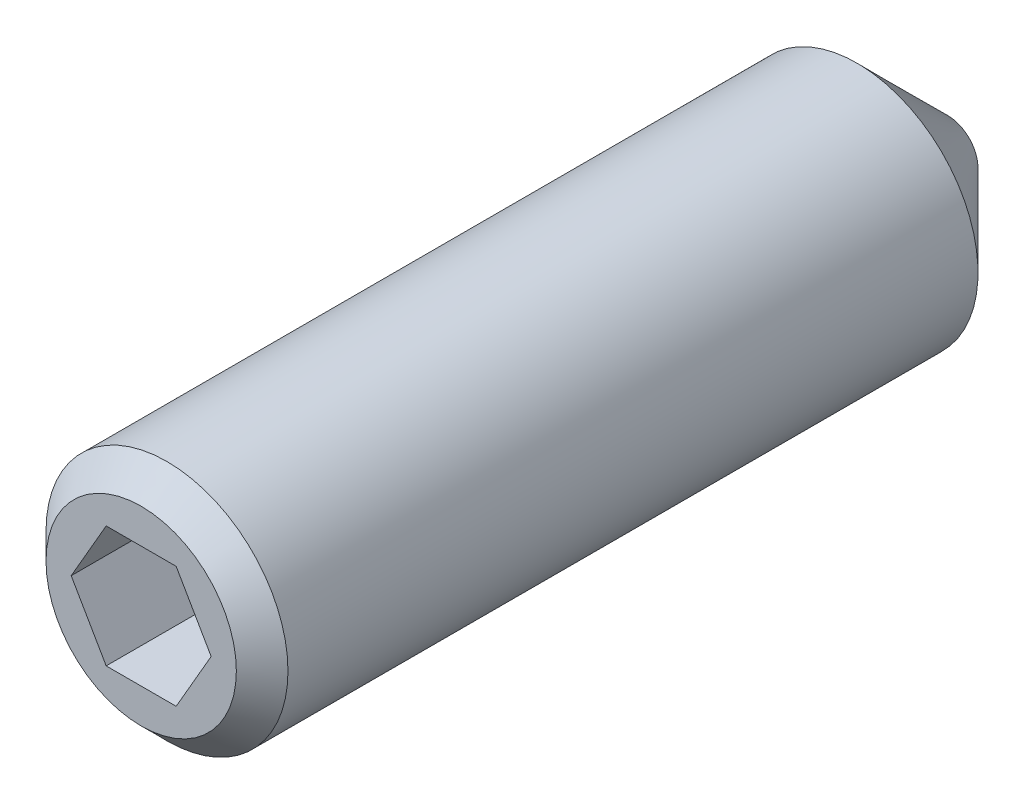
ISO-10303-21;
HEADER;
FILE_DESCRIPTION(('STEP AP214'),'2;1');
FILE_NAME('part.step','',(''),(''),'','','');
FILE_SCHEMA(('AUTOMOTIVE_DESIGN { 1 0 10303 214 1 1 1 1 }'));
ENDSEC;
DATA;
#1=APPLICATION_CONTEXT('core data for automotive mechanical design processes');
#2=APPLICATION_PROTOCOL_DEFINITION('international standard','automotive_design',2000,#1);
#3=PRODUCT_CONTEXT('',#1,'mechanical');
#4=PRODUCT('Part','Part','',(#3));
#5=PRODUCT_RELATED_PRODUCT_CATEGORY('part','',(#4));
#6=PRODUCT_DEFINITION_FORMATION('','',#4);
#7=PRODUCT_DEFINITION_CONTEXT('part definition',#1,'design');
#8=PRODUCT_DEFINITION('design','',#6,#7);
#9=PRODUCT_DEFINITION_SHAPE('','',#8);
#10=(LENGTH_UNIT() NAMED_UNIT(*) SI_UNIT(.MILLI.,.METRE.));
#11=(NAMED_UNIT(*) PLANE_ANGLE_UNIT() SI_UNIT($,.RADIAN.));
#12=(NAMED_UNIT(*) SI_UNIT($,.STERADIAN.) SOLID_ANGLE_UNIT());
#13=UNCERTAINTY_MEASURE_WITH_UNIT(LENGTH_MEASURE(1.E-05),#10,'distance_accuracy_value','');
#14=(GEOMETRIC_REPRESENTATION_CONTEXT(3) GLOBAL_UNCERTAINTY_ASSIGNED_CONTEXT((#13)) GLOBAL_UNIT_ASSIGNED_CONTEXT((#10,
#11,#12)) REPRESENTATION_CONTEXT('',''));
#15=CARTESIAN_POINT('',(0.,0.,0.));
#16=DIRECTION('',(0.,0.,1.));
#17=DIRECTION('',(1.,0.,0.));
#18=AXIS2_PLACEMENT_3D('',#15,#16,#17);
#19=CARTESIAN_POINT('',(0.,0.,10.));
#20=DIRECTION('',(0.,0.,-1.));
#21=DIRECTION('',(-1.,0.,0.));
#22=AXIS2_PLACEMENT_3D('',#19,#20,#21);
#23=CYLINDRICAL_SURFACE('',#22,1.5);
#24=CARTESIAN_POINT('',(0.,0.,9.68));
#25=DIRECTION('',(0.,0.,-1.));
#26=DIRECTION('',(-1.,0.,0.));
#27=AXIS2_PLACEMENT_3D('',#24,#25,#26);
#28=CIRCLE('',#27,1.5);
#29=CARTESIAN_POINT('',(-1.5,0.,9.68));
#30=VERTEX_POINT('',#29);
#31=EDGE_CURVE('E124',#30,#30,#28,.F.);
#32=ORIENTED_EDGE('',*,*,#31,.F.);
#33=EDGE_LOOP('',(#32));
#34=FACE_BOUND('',#33,.T.);
#35=CARTESIAN_POINT('',(0.,0.,1.125));
#36=DIRECTION('',(0.,0.,1.));
#37=DIRECTION('',(1.,0.,0.));
#38=AXIS2_PLACEMENT_3D('',#35,#36,#37);
#39=CIRCLE('',#38,1.5);
#40=CARTESIAN_POINT('',(-1.5,0.,1.125));
#41=VERTEX_POINT('',#40);
#42=EDGE_CURVE('E39',#41,#41,#39,.F.);
#43=ORIENTED_EDGE('',*,*,#42,.F.);
#44=EDGE_LOOP('',(#43));
#45=FACE_BOUND('',#44,.T.);
#46=ADVANCED_FACE('F36',(#34,#45),#23,.T.);
#47=CARTESIAN_POINT('',(0.,0.,10.));
#48=DIRECTION('',(0.,0.,1.));
#49=DIRECTION('',(1.,0.,0.));
#50=AXIS2_PLACEMENT_3D('',#47,#48,#49);
#51=PLANE('',#50);
#52=DIRECTION('',(0.499999999999995,0.866025403784441,0.));
#53=VECTOR('',#52,1.);
#54=CARTESIAN_POINT('',(0.43382575183851,-0.751408243816046,10.));
#55=LINE('',#54,#53);
#56=CARTESIAN_POINT('',(0.43382575183851,-0.751408243816046,10.));
#57=VERTEX_POINT('',#56);
#58=CARTESIAN_POINT('',(0.867651503677002,0.,10.));
#59=VERTEX_POINT('',#58);
#60=EDGE_CURVE('E51',#57,#59,#55,.T.);
#61=ORIENTED_EDGE('',*,*,#60,.F.);
#62=DIRECTION('',(1.,0.,0.));
#63=VECTOR('',#62,1.);
#64=CARTESIAN_POINT('',(-0.433825751838494,-0.751408243816055,10.));
#65=LINE('',#64,#63);
#66=CARTESIAN_POINT('',(-0.433825751838494,-0.751408243816055,10.));
#67=VERTEX_POINT('',#66);
#68=EDGE_CURVE('E133',#67,#57,#65,.T.);
#69=ORIENTED_EDGE('',*,*,#68,.F.);
#70=DIRECTION('',(0.500000000000007,-0.866025403784435,0.));
#71=VECTOR('',#70,1.);
#72=CARTESIAN_POINT('',(-0.867651503677002,0.,10.));
#73=LINE('',#72,#71);
#74=CARTESIAN_POINT('',(-0.867651503677002,0.,10.));
#75=VERTEX_POINT('',#74);
#76=EDGE_CURVE('E131',#75,#67,#73,.T.);
#77=ORIENTED_EDGE('',*,*,#76,.F.);
#78=DIRECTION('',(-0.499999999999995,-0.866025403784442,0.));
#79=VECTOR('',#78,1.);
#80=CARTESIAN_POINT('',(-0.433825751838504,0.751408243816049,10.));
#81=LINE('',#80,#79);
#82=CARTESIAN_POINT('',(-0.433825751838504,0.751408243816049,10.));
#83=VERTEX_POINT('',#82);
#84=EDGE_CURVE('E98',#83,#75,#81,.T.);
#85=ORIENTED_EDGE('',*,*,#84,.F.);
#86=DIRECTION('',(-1.,0.,0.));
#87=VECTOR('',#86,1.);
#88=CARTESIAN_POINT('',(0.433825751838499,0.751408243816052,10.));
#89=LINE('',#88,#87);
#90=CARTESIAN_POINT('',(0.433825751838499,0.751408243816052,10.));
#91=VERTEX_POINT('',#90);
#92=EDGE_CURVE('E127',#91,#83,#89,.T.);
#93=ORIENTED_EDGE('',*,*,#92,.F.);
#94=DIRECTION('',(-0.500000000000001,0.866025403784438,0.));
#95=VECTOR('',#94,1.);
#96=CARTESIAN_POINT('',(0.867651503677002,0.,10.));
#97=LINE('',#96,#95);
#98=EDGE_CURVE('E123',#59,#91,#97,.T.);
#99=ORIENTED_EDGE('',*,*,#98,.F.);
#100=EDGE_LOOP('',(#61,#69,#77,#85,#93,#99));
#101=FACE_BOUND('',#100,.T.);
#102=CARTESIAN_POINT('',(0.,0.,10.));
#103=DIRECTION('',(0.,0.,1.));
#104=DIRECTION('',(1.,0.,0.));
#105=AXIS2_PLACEMENT_3D('',#102,#103,#104);
#106=CIRCLE('',#105,1.18);
#107=CARTESIAN_POINT('',(1.18,0.,10.));
#108=VERTEX_POINT('',#107);
#109=EDGE_CURVE('E153',#108,#108,#106,.T.);
#110=ORIENTED_EDGE('',*,*,#109,.T.);
#111=EDGE_LOOP('',(#110));
#112=FACE_BOUND('',#111,.T.);
#113=ADVANCED_FACE('F144',(#101,#112),#51,.T.);
#114=CARTESIAN_POINT('',(0.43382575183851,-0.751408243816046,8.8));
#115=DIRECTION('',(0.866025403784441,-0.499999999999995,0.));
#116=DIRECTION('',(0.499999999999995,0.866025403784442,0.));
#117=AXIS2_PLACEMENT_3D('',#114,#115,#116);
#118=PLANE('',#117);
#119=ORIENTED_EDGE('',*,*,#60,.T.);
#120=DIRECTION('',(0.,0.,1.));
#121=VECTOR('',#120,1.);
#122=CARTESIAN_POINT('',(0.867651503677002,0.,8.8));
#123=LINE('',#122,#121);
#124=CARTESIAN_POINT('',(0.867651503677002,0.,8.8));
#125=VERTEX_POINT('',#124);
#126=EDGE_CURVE('E80',#125,#59,#123,.T.);
#127=ORIENTED_EDGE('',*,*,#126,.F.);
#128=DIRECTION('',(0.499999999999995,0.866025403784441,0.));
#129=VECTOR('',#128,1.);
#130=CARTESIAN_POINT('',(0.43382575183851,-0.751408243816046,8.8));
#131=LINE('',#130,#129);
#132=CARTESIAN_POINT('',(0.43382575183851,-0.751408243816046,8.8));
#133=VERTEX_POINT('',#132);
#134=EDGE_CURVE('E134',#133,#125,#131,.T.);
#135=ORIENTED_EDGE('',*,*,#134,.F.);
#136=DIRECTION('',(0.,0.,1.));
#137=VECTOR('',#136,1.);
#138=CARTESIAN_POINT('',(0.43382575183851,-0.751408243816046,8.8));
#139=LINE('',#138,#137);
#140=EDGE_CURVE('E12',#133,#57,#139,.T.);
#141=ORIENTED_EDGE('',*,*,#140,.T.);
#142=EDGE_LOOP('',(#119,#127,#135,#141));
#143=FACE_BOUND('',#142,.T.);
#144=ADVANCED_FACE('F170',(#143),#118,.F.);
#145=CARTESIAN_POINT('',(-0.433825751838494,-0.751408243816055,8.8));
#146=DIRECTION('',(0.,-1.,0.));
#147=DIRECTION('',(1.,0.,0.));
#148=AXIS2_PLACEMENT_3D('',#145,#146,#147);
#149=PLANE('',#148);
#150=ORIENTED_EDGE('',*,*,#68,.T.);
#151=ORIENTED_EDGE('',*,*,#140,.F.);
#152=DIRECTION('',(1.,0.,0.));
#153=VECTOR('',#152,1.);
#154=CARTESIAN_POINT('',(-0.433825751838494,-0.751408243816055,8.8));
#155=LINE('',#154,#153);
#156=CARTESIAN_POINT('',(-0.433825751838494,-0.751408243816055,8.8));
#157=VERTEX_POINT('',#156);
#158=EDGE_CURVE('E109',#157,#133,#155,.T.);
#159=ORIENTED_EDGE('',*,*,#158,.F.);
#160=DIRECTION('',(0.,0.,1.));
#161=VECTOR('',#160,1.);
#162=CARTESIAN_POINT('',(-0.433825751838494,-0.751408243816055,8.8));
#163=LINE('',#162,#161);
#164=EDGE_CURVE('E44',#157,#67,#163,.T.);
#165=ORIENTED_EDGE('',*,*,#164,.T.);
#166=EDGE_LOOP('',(#150,#151,#159,#165));
#167=FACE_BOUND('',#166,.T.);
#168=ADVANCED_FACE('F188',(#167),#149,.F.);
#169=CARTESIAN_POINT('',(-0.867651503677002,0.,8.8));
#170=DIRECTION('',(-0.866025403784434,-0.500000000000007,0.));
#171=DIRECTION('',(0.500000000000007,-0.866025403784435,0.));
#172=AXIS2_PLACEMENT_3D('',#169,#170,#171);
#173=PLANE('',#172);
#174=ORIENTED_EDGE('',*,*,#76,.T.);
#175=ORIENTED_EDGE('',*,*,#164,.F.);
#176=DIRECTION('',(0.500000000000007,-0.866025403784435,0.));
#177=VECTOR('',#176,1.);
#178=CARTESIAN_POINT('',(-0.867651503677002,0.,8.8));
#179=LINE('',#178,#177);
#180=CARTESIAN_POINT('',(-0.867651503677002,0.,8.8));
#181=VERTEX_POINT('',#180);
#182=EDGE_CURVE('E105',#181,#157,#179,.T.);
#183=ORIENTED_EDGE('',*,*,#182,.F.);
#184=DIRECTION('',(0.,0.,1.));
#185=VECTOR('',#184,1.);
#186=CARTESIAN_POINT('',(-0.867651503677002,0.,8.8));
#187=LINE('',#186,#185);
#188=EDGE_CURVE('E91',#181,#75,#187,.T.);
#189=ORIENTED_EDGE('',*,*,#188,.T.);
#190=EDGE_LOOP('',(#174,#175,#183,#189));
#191=FACE_BOUND('',#190,.T.);
#192=ADVANCED_FACE('F106',(#191),#173,.F.);
#193=CARTESIAN_POINT('',(-0.433825751838504,0.751408243816049,8.8));
#194=DIRECTION('',(-0.866025403784441,0.499999999999995,0.));
#195=DIRECTION('',(-0.499999999999995,-0.866025403784442,0.));
#196=AXIS2_PLACEMENT_3D('',#193,#194,#195);
#197=PLANE('',#196);
#198=ORIENTED_EDGE('',*,*,#84,.T.);
#199=ORIENTED_EDGE('',*,*,#188,.F.);
#200=DIRECTION('',(-0.499999999999995,-0.866025403784442,0.));
#201=VECTOR('',#200,1.);
#202=CARTESIAN_POINT('',(-0.433825751838504,0.751408243816049,8.8));
#203=LINE('',#202,#201);
#204=CARTESIAN_POINT('',(-0.433825751838504,0.751408243816049,8.8));
#205=VERTEX_POINT('',#204);
#206=EDGE_CURVE('E95',#205,#181,#203,.T.);
#207=ORIENTED_EDGE('',*,*,#206,.F.);
#208=DIRECTION('',(0.,0.,1.));
#209=VECTOR('',#208,1.);
#210=CARTESIAN_POINT('',(-0.433825751838504,0.751408243816049,8.8));
#211=LINE('',#210,#209);
#212=EDGE_CURVE('E102',#205,#83,#211,.T.);
#213=ORIENTED_EDGE('',*,*,#212,.T.);
#214=EDGE_LOOP('',(#198,#199,#207,#213));
#215=FACE_BOUND('',#214,.T.);
#216=ADVANCED_FACE('F93',(#215),#197,.F.);
#217=CARTESIAN_POINT('',(0.433825751838499,0.751408243816052,8.8));
#218=DIRECTION('',(0.,1.,0.));
#219=DIRECTION('',(-1.,0.,0.));
#220=AXIS2_PLACEMENT_3D('',#217,#218,#219);
#221=PLANE('',#220);
#222=ORIENTED_EDGE('',*,*,#92,.T.);
#223=ORIENTED_EDGE('',*,*,#212,.F.);
#224=DIRECTION('',(-1.,0.,0.));
#225=VECTOR('',#224,1.);
#226=CARTESIAN_POINT('',(0.433825751838499,0.751408243816052,8.8));
#227=LINE('',#226,#225);
#228=CARTESIAN_POINT('',(0.433825751838499,0.751408243816052,8.8));
#229=VERTEX_POINT('',#228);
#230=EDGE_CURVE('E115',#229,#205,#227,.T.);
#231=ORIENTED_EDGE('',*,*,#230,.F.);
#232=DIRECTION('',(0.,0.,1.));
#233=VECTOR('',#232,1.);
#234=CARTESIAN_POINT('',(0.433825751838499,0.751408243816052,8.8));
#235=LINE('',#234,#233);
#236=EDGE_CURVE('E138',#229,#91,#235,.T.);
#237=ORIENTED_EDGE('',*,*,#236,.T.);
#238=EDGE_LOOP('',(#222,#223,#231,#237));
#239=FACE_BOUND('',#238,.T.);
#240=ADVANCED_FACE('F148',(#239),#221,.F.);
#241=CARTESIAN_POINT('',(0.867651503677002,0.,8.8));
#242=DIRECTION('',(0.866025403784438,0.500000000000001,0.));
#243=DIRECTION('',(-0.500000000000001,0.866025403784438,0.));
#244=AXIS2_PLACEMENT_3D('',#241,#242,#243);
#245=PLANE('',#244);
#246=ORIENTED_EDGE('',*,*,#98,.T.);
#247=ORIENTED_EDGE('',*,*,#236,.F.);
#248=DIRECTION('',(-0.500000000000001,0.866025403784438,0.));
#249=VECTOR('',#248,1.);
#250=CARTESIAN_POINT('',(0.867651503677002,0.,8.8));
#251=LINE('',#250,#249);
#252=EDGE_CURVE('E117',#125,#229,#251,.T.);
#253=ORIENTED_EDGE('',*,*,#252,.F.);
#254=ORIENTED_EDGE('',*,*,#126,.T.);
#255=EDGE_LOOP('',(#246,#247,#253,#254));
#256=FACE_BOUND('',#255,.T.);
#257=ADVANCED_FACE('F141',(#256),#245,.F.);
#258=CARTESIAN_POINT('',(0.,0.,8.8));
#259=DIRECTION('',(0.,0.,1.));
#260=DIRECTION('',(1.,0.,0.));
#261=AXIS2_PLACEMENT_3D('',#258,#259,#260);
#262=PLANE('',#261);
#263=ORIENTED_EDGE('',*,*,#134,.T.);
#264=ORIENTED_EDGE('',*,*,#252,.T.);
#265=ORIENTED_EDGE('',*,*,#230,.T.);
#266=ORIENTED_EDGE('',*,*,#206,.T.);
#267=ORIENTED_EDGE('',*,*,#182,.T.);
#268=ORIENTED_EDGE('',*,*,#158,.T.);
#269=EDGE_LOOP('',(#263,#264,#265,#266,#267,#268));
#270=FACE_BOUND('',#269,.T.);
#271=ADVANCED_FACE('F112',(#270),#262,.T.);
#272=CARTESIAN_POINT('',(0.,0.,10.));
#273=DIRECTION('',(0.,0.,-1.));
#274=DIRECTION('',(1.,0.,0.));
#275=AXIS2_PLACEMENT_3D('',#272,#273,#274);
#276=CONICAL_SURFACE('',#275,1.18,0.78539816339745);
#277=ORIENTED_EDGE('',*,*,#109,.F.);
#278=EDGE_LOOP('',(#277));
#279=FACE_BOUND('',#278,.T.);
#280=ORIENTED_EDGE('',*,*,#31,.T.);
#281=EDGE_LOOP('',(#280));
#282=FACE_BOUND('',#281,.T.);
#283=ADVANCED_FACE('F174',(#279,#282),#276,.T.);
#284=CARTESIAN_POINT('',(0.,0.,0.));
#285=DIRECTION('',(0.,0.,1.));
#286=DIRECTION('',(-1.,0.,0.));
#287=AXIS2_PLACEMENT_3D('',#284,#285,#286);
#288=CONICAL_SURFACE('',#287,0.375,0.78539816339745);
#289=CARTESIAN_POINT('',(0.,0.,0.));
#290=DIRECTION('',(0.,0.,-1.));
#291=DIRECTION('',(-1.,0.,0.));
#292=AXIS2_PLACEMENT_3D('',#289,#290,#291);
#293=CIRCLE('',#292,0.375);
#294=CARTESIAN_POINT('',(-0.375,0.,0.));
#295=VERTEX_POINT('',#294);
#296=EDGE_CURVE('E156',#295,#295,#293,.T.);
#297=CARTESIAN_POINT('',(-0.375,0.,0.));
#298=CARTESIAN_POINT('',(-0.38671875,0.,0.0117187499999999));
#299=CARTESIAN_POINT('',(-0.3984375,0.,0.0234374999999999));
#300=CARTESIAN_POINT('',(-0.421875,0.,0.0468749999999998));
#301=CARTESIAN_POINT('',(-0.43359375,0.,0.0585937499999998));
#302=CARTESIAN_POINT('',(-0.45703125,0.,0.0820312499999997));
#303=CARTESIAN_POINT('',(-0.46875,0.,0.0937499999999996));
#304=CARTESIAN_POINT('',(-0.4921875,0.,0.1171875));
#305=CARTESIAN_POINT('',(-0.50390625,0.,0.12890625));
#306=CARTESIAN_POINT('',(-0.52734375,0.,0.152343749999999));
#307=CARTESIAN_POINT('',(-0.5390625,0.,0.164062499999999));
#308=CARTESIAN_POINT('',(-0.5625,0.,0.187499999999999));
#309=CARTESIAN_POINT('',(-0.57421875,0.,0.199218749999999));
#310=CARTESIAN_POINT('',(-0.59765625,0.,0.222656249999999));
#311=CARTESIAN_POINT('',(-0.609375,0.,0.234374999999999));
#312=CARTESIAN_POINT('',(-0.6328125,0.,0.257812499999999));
#313=CARTESIAN_POINT('',(-0.64453125,0.,0.269531249999999));
#314=CARTESIAN_POINT('',(-0.66796875,0.,0.292968749999999));
#315=CARTESIAN_POINT('',(-0.6796875,0.,0.304687499999999));
#316=CARTESIAN_POINT('',(-0.703125,0.,0.328124999999999));
#317=CARTESIAN_POINT('',(-0.71484375,0.,0.339843749999999));
#318=CARTESIAN_POINT('',(-0.73828125,0.,0.363281249999999));
#319=CARTESIAN_POINT('',(-0.75,0.,0.374999999999999));
#320=CARTESIAN_POINT('',(-0.7734375,0.,0.398437499999999));
#321=CARTESIAN_POINT('',(-0.78515625,0.,0.410156249999998));
#322=CARTESIAN_POINT('',(-0.80859375,0.,0.433593749999998));
#323=CARTESIAN_POINT('',(-0.8203125,0.,0.445312499999998));
#324=CARTESIAN_POINT('',(-0.84375,0.,0.468749999999998));
#325=CARTESIAN_POINT('',(-0.85546875,0.,0.480468749999998));
#326=CARTESIAN_POINT('',(-0.87890625,0.,0.503906249999998));
#327=CARTESIAN_POINT('',(-0.890625,0.,0.515624999999998));
#328=CARTESIAN_POINT('',(-0.9140625,0.,0.539062499999998));
#329=CARTESIAN_POINT('',(-0.92578125,0.,0.550781249999998));
#330=CARTESIAN_POINT('',(-0.94921875,0.,0.574218749999998));
#331=CARTESIAN_POINT('',(-0.9609375,0.,0.585937499999998));
#332=CARTESIAN_POINT('',(-0.984375,0.,0.609374999999998));
#333=CARTESIAN_POINT('',(-0.99609375,0.,0.621093749999998));
#334=CARTESIAN_POINT('',(-1.01953125,0.,0.644531249999998));
#335=CARTESIAN_POINT('',(-1.03125,0.,0.656249999999998));
#336=CARTESIAN_POINT('',(-1.0546875,0.,0.679687499999997));
#337=CARTESIAN_POINT('',(-1.06640625,0.,0.691406249999997));
#338=CARTESIAN_POINT('',(-1.08984375,0.,0.714843749999997));
#339=CARTESIAN_POINT('',(-1.1015625,0.,0.726562499999997));
#340=CARTESIAN_POINT('',(-1.125,0.,0.749999999999997));
#341=CARTESIAN_POINT('',(-1.13671875,0.,0.761718749999997));
#342=CARTESIAN_POINT('',(-1.16015625,0.,0.785156249999997));
#343=CARTESIAN_POINT('',(-1.171875,0.,0.796874999999997));
#344=CARTESIAN_POINT('',(-1.1953125,0.,0.820312499999997));
#345=CARTESIAN_POINT('',(-1.20703125,0.,0.832031249999997));
#346=CARTESIAN_POINT('',(-1.23046875,0.,0.855468749999997));
#347=CARTESIAN_POINT('',(-1.2421875,0.,0.867187499999997));
#348=CARTESIAN_POINT('',(-1.265625,0.,0.890624999999997));
#349=CARTESIAN_POINT('',(-1.27734375,0.,0.902343749999997));
#350=CARTESIAN_POINT('',(-1.30078125,0.,0.925781249999997));
#351=CARTESIAN_POINT('',(-1.3125,0.,0.937499999999996));
#352=CARTESIAN_POINT('',(-1.3359375,0.,0.960937499999996));
#353=CARTESIAN_POINT('',(-1.34765625,0.,0.972656249999996));
#354=CARTESIAN_POINT('',(-1.37109375,0.,0.996093749999996));
#355=CARTESIAN_POINT('',(-1.3828125,0.,1.0078125));
#356=CARTESIAN_POINT('',(-1.40625,0.,1.03125));
#357=CARTESIAN_POINT('',(-1.41796875,0.,1.04296875));
#358=CARTESIAN_POINT('',(-1.44140625,0.,1.06640625));
#359=CARTESIAN_POINT('',(-1.453125,0.,1.078125));
#360=CARTESIAN_POINT('',(-1.4765625,0.,1.1015625));
#361=CARTESIAN_POINT('',(-1.48828125,0.,1.11328125));
#362=CARTESIAN_POINT('',(-1.5,0.,1.125));
#363=B_SPLINE_CURVE_WITH_KNOTS('',3,(#297,#298,#299,#300,#301,#302,#303,#304,#305,#306,#307,
#308,#309,#310,#311,#312,#313,#314,#315,#316,#317,#318,#319,#320,#321,#322,#323,#324,#325,#326,
#327,#328,#329,#330,#331,#332,#333,#334,#335,#336,#337,#338,#339,#340,#341,#342,#343,#344,#345,
#346,#347,#348,#349,#350,#351,#352,#353,#354,#355,#356,#357,#358,#359,#360,#361,#362),
.UNSPECIFIED.,.F.,.F.,(4,2,2,2,2,2,2,2,2,2,2,2,2,2,2,2,2,2,2,2,2,2,2,2,2,2,2,2,2,2,2,2,4),(0.,
0.049718445552179,0.099436891104358,0.149155336656537,0.198873782208716,0.248592227760895,
0.298310673313074,0.348029118865253,0.397747564417432,0.447466009969611,0.49718445552179,
0.546902901073969,0.596621346626148,0.646339792178327,0.696058237730506,0.745776683282685,
0.795495128834864,0.845213574387043,0.894932019939222,0.944650465491402,0.99436891104358,
1.04408735659576,1.09380580214794,1.14352424770012,1.1932426932523,1.24296113880448,
1.29267958435665,1.34239802990883,1.39211647546101,1.44183492101319,1.49155336656537,
1.54127181211755,1.59099025766973),.UNSPECIFIED.);
#364=EDGE_CURVE('BSEAM163',#295,#41,#363,.T.);
#365=ORIENTED_EDGE('',*,*,#296,.F.);
#366=ORIENTED_EDGE('',*,*,#42,.T.);
#367=ORIENTED_EDGE('',*,*,#364,.T.);
#368=ORIENTED_EDGE('',*,*,#364,.F.);
#369=EDGE_LOOP('',(#365,#367,#366,#368));
#370=FACE_BOUND('',#369,.T.);
#371=ADVANCED_FACE('F163',(#370),#288,.T.);
#372=CARTESIAN_POINT('',(0.,0.,0.));
#373=DIRECTION('',(0.,0.,1.));
#374=DIRECTION('',(1.,0.,0.));
#375=AXIS2_PLACEMENT_3D('',#372,#373,#374);
#376=PLANE('',#375);
#377=ORIENTED_EDGE('',*,*,#296,.T.);
#378=EDGE_LOOP('',(#377));
#379=FACE_BOUND('',#378,.T.);
#380=ADVANCED_FACE('F182',(#379),#376,.F.);
#381=CLOSED_SHELL('',(#46,#113,#144,#168,#192,#216,#240,#257,#271,#283,#371,#380));
#382=MANIFOLD_SOLID_BREP('B2',#381);
#383=ADVANCED_BREP_SHAPE_REPRESENTATION('',(#18,#382),#14);
#384=SHAPE_DEFINITION_REPRESENTATION(#9,#383);
ENDSEC;
END-ISO-10303-21;
